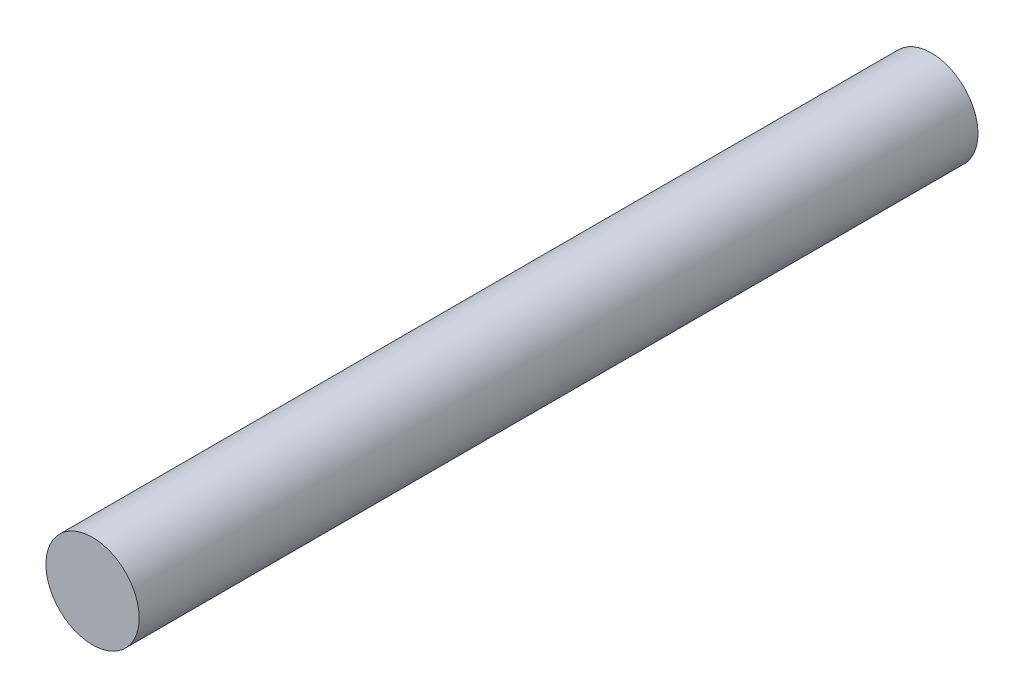
ISO-10303-21;
HEADER;
FILE_DESCRIPTION(('STEP AP214'),'2;1');
FILE_NAME('part.step','',(''),(''),'','','');
FILE_SCHEMA(('AUTOMOTIVE_DESIGN { 1 0 10303 214 1 1 1 1 }'));
ENDSEC;
DATA;
#1=APPLICATION_CONTEXT('core data for automotive mechanical design processes');
#2=APPLICATION_PROTOCOL_DEFINITION('international standard','automotive_design',2000,#1);
#3=PRODUCT_CONTEXT('',#1,'mechanical');
#4=PRODUCT('Part','Part','',(#3));
#5=PRODUCT_RELATED_PRODUCT_CATEGORY('part','',(#4));
#6=PRODUCT_DEFINITION_FORMATION('','',#4);
#7=PRODUCT_DEFINITION_CONTEXT('part definition',#1,'design');
#8=PRODUCT_DEFINITION('design','',#6,#7);
#9=PRODUCT_DEFINITION_SHAPE('','',#8);
#10=(LENGTH_UNIT() NAMED_UNIT(*) SI_UNIT(.MILLI.,.METRE.));
#11=(NAMED_UNIT(*) PLANE_ANGLE_UNIT() SI_UNIT($,.RADIAN.));
#12=(NAMED_UNIT(*) SI_UNIT($,.STERADIAN.) SOLID_ANGLE_UNIT());
#13=UNCERTAINTY_MEASURE_WITH_UNIT(LENGTH_MEASURE(1.E-05),#10,'distance_accuracy_value','');
#14=(GEOMETRIC_REPRESENTATION_CONTEXT(3) GLOBAL_UNCERTAINTY_ASSIGNED_CONTEXT((#13)) GLOBAL_UNIT_ASSIGNED_CONTEXT((#10,
#11,#12)) REPRESENTATION_CONTEXT('',''));
#15=CARTESIAN_POINT('',(0.,0.,0.));
#16=DIRECTION('',(0.,0.,1.));
#17=DIRECTION('',(1.,0.,0.));
#18=AXIS2_PLACEMENT_3D('',#15,#16,#17);
#19=CARTESIAN_POINT('',(0.,0.,57.15));
#20=DIRECTION('',(0.,0.,-1.));
#21=DIRECTION('',(-1.,0.,0.));
#22=AXIS2_PLACEMENT_3D('',#19,#20,#21);
#23=CYLINDRICAL_SURFACE('',#22,3.175);
#24=CARTESIAN_POINT('',(0.,0.,57.15));
#25=DIRECTION('',(0.,0.,1.));
#26=DIRECTION('',(1.,0.,0.));
#27=AXIS2_PLACEMENT_3D('',#24,#25,#26);
#28=CIRCLE('',#27,3.175);
#29=CARTESIAN_POINT('',(3.175,0.,57.15));
#30=VERTEX_POINT('',#29);
#31=EDGE_CURVE('E10',#30,#30,#28,.T.);
#32=ORIENTED_EDGE('',*,*,#31,.F.);
#33=EDGE_LOOP('',(#32));
#34=FACE_BOUND('',#33,.T.);
#35=CARTESIAN_POINT('',(0.,0.,0.));
#36=DIRECTION('',(0.,0.,1.));
#37=DIRECTION('',(1.,0.,0.));
#38=AXIS2_PLACEMENT_3D('',#35,#36,#37);
#39=CIRCLE('',#38,3.175);
#40=CARTESIAN_POINT('',(3.175,0.,0.));
#41=VERTEX_POINT('',#40);
#42=EDGE_CURVE('E46',#41,#41,#39,.T.);
#43=ORIENTED_EDGE('',*,*,#42,.T.);
#44=EDGE_LOOP('',(#43));
#45=FACE_BOUND('',#44,.T.);
#46=ADVANCED_FACE('F43',(#34,#45),#23,.T.);
#47=CARTESIAN_POINT('',(0.,0.,57.15));
#48=DIRECTION('',(0.,0.,1.));
#49=DIRECTION('',(1.,0.,0.));
#50=AXIS2_PLACEMENT_3D('',#47,#48,#49);
#51=PLANE('',#50);
#52=ORIENTED_EDGE('',*,*,#31,.T.);
#53=EDGE_LOOP('',(#52));
#54=FACE_BOUND('',#53,.T.);
#55=ADVANCED_FACE('F60',(#54),#51,.T.);
#56=CARTESIAN_POINT('',(0.,0.,0.));
#57=DIRECTION('',(0.,0.,1.));
#58=DIRECTION('',(1.,0.,0.));
#59=AXIS2_PLACEMENT_3D('',#56,#57,#58);
#60=PLANE('',#59);
#61=ORIENTED_EDGE('',*,*,#42,.F.);
#62=EDGE_LOOP('',(#61));
#63=FACE_BOUND('',#62,.T.);
#64=ADVANCED_FACE('F58',(#63),#60,.F.);
#65=CLOSED_SHELL('',(#46,#55,#64));
#66=MANIFOLD_SOLID_BREP('B2',#65);
#67=ADVANCED_BREP_SHAPE_REPRESENTATION('',(#18,#66),#14);
#68=SHAPE_DEFINITION_REPRESENTATION(#9,#67);
ENDSEC;
END-ISO-10303-21;
